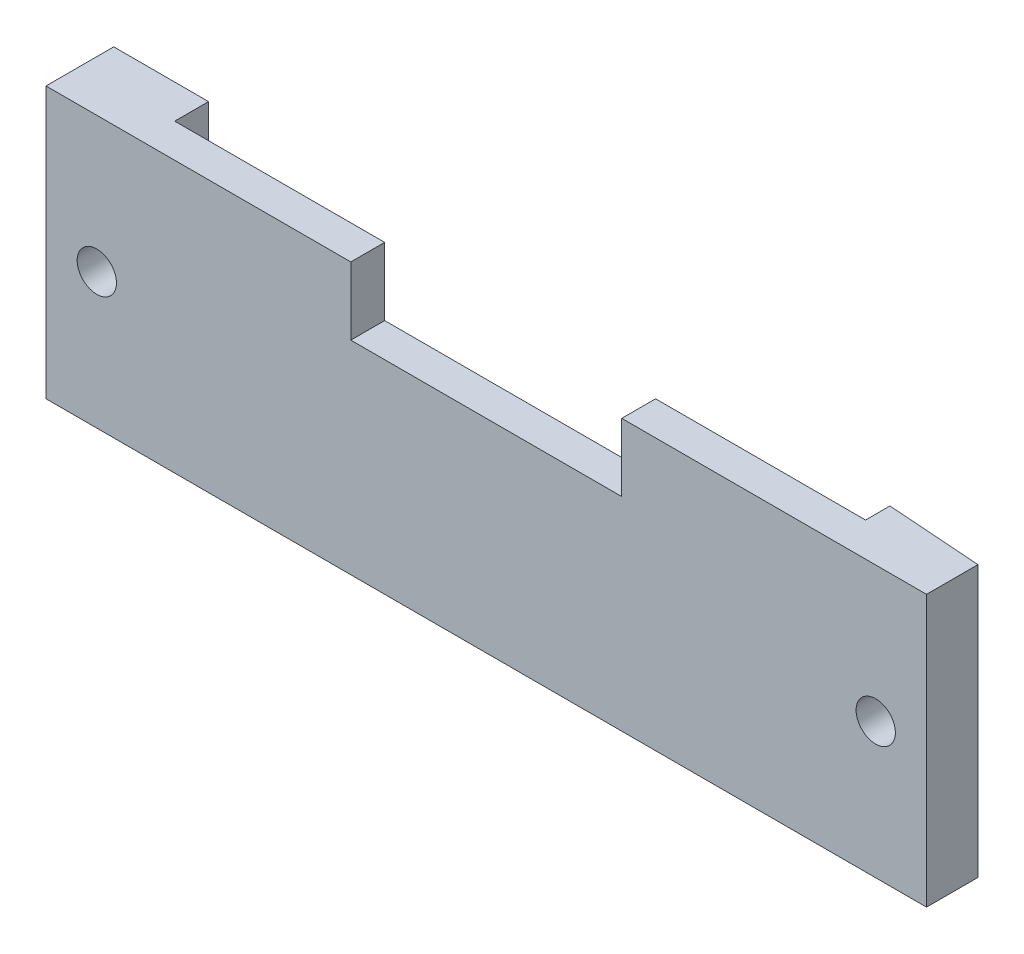
ISO-10303-21;
HEADER;
FILE_DESCRIPTION(('STEP AP214'),'2;1');
FILE_NAME('part.step','',(''),(''),'','','');
FILE_SCHEMA(('AUTOMOTIVE_DESIGN { 1 0 10303 214 1 1 1 1 }'));
ENDSEC;
DATA;
#1=APPLICATION_CONTEXT('core data for automotive mechanical design processes');
#2=APPLICATION_PROTOCOL_DEFINITION('international standard','automotive_design',2000,#1);
#3=PRODUCT_CONTEXT('',#1,'mechanical');
#4=PRODUCT('Part','Part','',(#3));
#5=PRODUCT_RELATED_PRODUCT_CATEGORY('part','',(#4));
#6=PRODUCT_DEFINITION_FORMATION('','',#4);
#7=PRODUCT_DEFINITION_CONTEXT('part definition',#1,'design');
#8=PRODUCT_DEFINITION('design','',#6,#7);
#9=PRODUCT_DEFINITION_SHAPE('','',#8);
#10=(LENGTH_UNIT() NAMED_UNIT(*) SI_UNIT(.MILLI.,.METRE.));
#11=(NAMED_UNIT(*) PLANE_ANGLE_UNIT() SI_UNIT($,.RADIAN.));
#12=(NAMED_UNIT(*) SI_UNIT($,.STERADIAN.) SOLID_ANGLE_UNIT());
#13=UNCERTAINTY_MEASURE_WITH_UNIT(LENGTH_MEASURE(1.E-05),#10,'distance_accuracy_value','');
#14=(GEOMETRIC_REPRESENTATION_CONTEXT(3) GLOBAL_UNCERTAINTY_ASSIGNED_CONTEXT((#13)) GLOBAL_UNIT_ASSIGNED_CONTEXT((#10,
#11,#12)) REPRESENTATION_CONTEXT('',''));
#15=CARTESIAN_POINT('',(0.,0.,0.));
#16=DIRECTION('',(0.,0.,1.));
#17=DIRECTION('',(1.,0.,0.));
#18=AXIS2_PLACEMENT_3D('',#15,#16,#17);
#19=CARTESIAN_POINT('',(32.5,20.,5.));
#20=DIRECTION('',(0.,-1.,0.));
#21=DIRECTION('',(1.,0.,0.));
#22=AXIS2_PLACEMENT_3D('',#19,#20,#21);
#23=PLANE('',#22);
#24=DIRECTION('',(0.,0.,-1.));
#25=VECTOR('',#24,1.);
#26=CARTESIAN_POINT('',(32.5,20.,5.));
#27=LINE('',#26,#25);
#28=CARTESIAN_POINT('',(32.5,20.,5.));
#29=VERTEX_POINT('',#28);
#30=CARTESIAN_POINT('',(32.5,20.,1.2));
#31=VERTEX_POINT('',#30);
#32=EDGE_CURVE('E48',#29,#31,#27,.T.);
#33=ORIENTED_EDGE('',*,*,#32,.T.);
#34=DIRECTION('',(0.997458699830735,0.,0.0712470499879097));
#35=VECTOR('',#34,1.);
#36=CARTESIAN_POINT('',(25.5,20.,0.699999999999999));
#37=LINE('',#36,#35);
#38=CARTESIAN_POINT('',(25.5,20.,0.699999999999999));
#39=VERTEX_POINT('',#38);
#40=EDGE_CURVE('E131',#39,#31,#37,.T.);
#41=ORIENTED_EDGE('',*,*,#40,.F.);
#42=DIRECTION('',(0.,0.,-1.));
#43=VECTOR('',#42,1.);
#44=CARTESIAN_POINT('',(25.5,20.,2.5));
#45=LINE('',#44,#43);
#46=CARTESIAN_POINT('',(25.5,20.,2.5));
#47=VERTEX_POINT('',#46);
#48=EDGE_CURVE('E166',#47,#39,#45,.T.);
#49=ORIENTED_EDGE('',*,*,#48,.F.);
#50=DIRECTION('',(1.,0.,0.));
#51=VECTOR('',#50,1.);
#52=CARTESIAN_POINT('',(-25.5,20.,2.5));
#53=LINE('',#52,#51);
#54=CARTESIAN_POINT('',(10.,20.,2.5));
#55=VERTEX_POINT('',#54);
#56=EDGE_CURVE('E209',#55,#47,#53,.T.);
#57=ORIENTED_EDGE('',*,*,#56,.F.);
#58=DIRECTION('',(0.,0.,1.));
#59=VECTOR('',#58,1.);
#60=CARTESIAN_POINT('',(10.,20.,-0.001000000000001));
#61=LINE('',#60,#59);
#62=CARTESIAN_POINT('',(10.,20.,5.));
#63=VERTEX_POINT('',#62);
#64=EDGE_CURVE('E179',#55,#63,#61,.T.);
#65=ORIENTED_EDGE('',*,*,#64,.T.);
#66=DIRECTION('',(-1.,0.,0.));
#67=VECTOR('',#66,1.);
#68=CARTESIAN_POINT('',(32.5,20.,5.));
#69=LINE('',#68,#67);
#70=EDGE_CURVE('E153',#29,#63,#69,.T.);
#71=ORIENTED_EDGE('',*,*,#70,.F.);
#72=EDGE_LOOP('',(#33,#41,#49,#57,#65,#71));
#73=FACE_BOUND('',#72,.T.);
#74=ADVANCED_FACE('F40',(#73),#23,.F.);
#75=CARTESIAN_POINT('',(0.,0.,0.));
#76=DIRECTION('',(0.,0.,-1.));
#77=DIRECTION('',(-1.,0.,0.));
#78=AXIS2_PLACEMENT_3D('',#75,#76,#77);
#79=PLANE('',#78);
#80=CARTESIAN_POINT('',(-28.75,9.99999999999999,0.));
#81=DIRECTION('',(0.,0.,-1.));
#82=DIRECTION('',(-1.,0.,0.));
#83=AXIS2_PLACEMENT_3D('',#80,#81,#82);
#84=CIRCLE('',#83,1.44999999999999);
#85=CARTESIAN_POINT('',(-30.2,9.99999999999999,0.));
#86=VERTEX_POINT('',#85);
#87=EDGE_CURVE('E203',#86,#86,#84,.T.);
#88=ORIENTED_EDGE('',*,*,#87,.F.);
#89=EDGE_LOOP('',(#88));
#90=FACE_BOUND('',#89,.T.);
#91=DIRECTION('',(0.,-1.,0.));
#92=VECTOR('',#91,1.);
#93=CARTESIAN_POINT('',(-25.5,20.001,0.));
#94=LINE('',#93,#92);
#95=CARTESIAN_POINT('',(-25.5,20.,0.));
#96=VERTEX_POINT('',#95);
#97=CARTESIAN_POINT('',(-25.5,0.,0.));
#98=VERTEX_POINT('',#97);
#99=EDGE_CURVE('E223',#96,#98,#94,.T.);
#100=ORIENTED_EDGE('',*,*,#99,.T.);
#101=DIRECTION('',(1.,0.,0.));
#102=VECTOR('',#101,1.);
#103=CARTESIAN_POINT('',(0.,0.,0.));
#104=LINE('',#103,#102);
#105=CARTESIAN_POINT('',(-32.5,0.,0.));
#106=VERTEX_POINT('',#105);
#107=EDGE_CURVE('E162',#106,#98,#104,.T.);
#108=ORIENTED_EDGE('',*,*,#107,.F.);
#109=DIRECTION('',(0.,-1.,0.));
#110=VECTOR('',#109,1.);
#111=CARTESIAN_POINT('',(-32.5,0.,0.));
#112=LINE('',#111,#110);
#113=CARTESIAN_POINT('',(-32.5,20.,0.));
#114=VERTEX_POINT('',#113);
#115=EDGE_CURVE('E155',#114,#106,#112,.T.);
#116=ORIENTED_EDGE('',*,*,#115,.F.);
#117=DIRECTION('',(-1.,0.,0.));
#118=VECTOR('',#117,1.);
#119=CARTESIAN_POINT('',(32.5,20.,0.));
#120=LINE('',#119,#118);
#121=EDGE_CURVE('E165',#96,#114,#120,.T.);
#122=ORIENTED_EDGE('',*,*,#121,.F.);
#123=EDGE_LOOP('',(#100,#108,#116,#122));
#124=FACE_BOUND('',#123,.T.);
#125=ADVANCED_FACE('F275',(#90,#124),#79,.T.);
#126=CARTESIAN_POINT('',(0.,0.,5.));
#127=DIRECTION('',(0.,1.,0.));
#128=DIRECTION('',(0.,0.,1.));
#129=AXIS2_PLACEMENT_3D('',#126,#127,#128);
#130=PLANE('',#129);
#131=DIRECTION('',(0.,0.,1.));
#132=VECTOR('',#131,1.);
#133=CARTESIAN_POINT('',(25.5,0.,2.5));
#134=LINE('',#133,#132);
#135=CARTESIAN_POINT('',(25.5,0.,0.699999999999999));
#136=VERTEX_POINT('',#135);
#137=CARTESIAN_POINT('',(25.5,0.,2.5));
#138=VERTEX_POINT('',#137);
#139=EDGE_CURVE('E143',#136,#138,#134,.T.);
#140=ORIENTED_EDGE('',*,*,#139,.F.);
#141=DIRECTION('',(-0.997458699830735,0.,-0.0712470499879097));
#142=VECTOR('',#141,1.);
#143=CARTESIAN_POINT('',(25.5,0.,0.699999999999999));
#144=LINE('',#143,#142);
#145=CARTESIAN_POINT('',(32.5,0.,1.2));
#146=VERTEX_POINT('',#145);
#147=EDGE_CURVE('E55',#146,#136,#144,.T.);
#148=ORIENTED_EDGE('',*,*,#147,.F.);
#149=DIRECTION('',(0.,0.,-1.));
#150=VECTOR('',#149,1.);
#151=CARTESIAN_POINT('',(32.5,0.,5.));
#152=LINE('',#151,#150);
#153=CARTESIAN_POINT('',(32.5,0.,5.));
#154=VERTEX_POINT('',#153);
#155=EDGE_CURVE('E11',#154,#146,#152,.T.);
#156=ORIENTED_EDGE('',*,*,#155,.F.);
#157=DIRECTION('',(1.,0.,0.));
#158=VECTOR('',#157,1.);
#159=CARTESIAN_POINT('',(0.,0.,5.));
#160=LINE('',#159,#158);
#161=CARTESIAN_POINT('',(-32.5,0.,5.));
#162=VERTEX_POINT('',#161);
#163=EDGE_CURVE('E151',#162,#154,#160,.T.);
#164=ORIENTED_EDGE('',*,*,#163,.F.);
#165=DIRECTION('',(0.,0.,-1.));
#166=VECTOR('',#165,1.);
#167=CARTESIAN_POINT('',(-32.5,0.,5.));
#168=LINE('',#167,#166);
#169=EDGE_CURVE('E161',#162,#106,#168,.T.);
#170=ORIENTED_EDGE('',*,*,#169,.T.);
#171=ORIENTED_EDGE('',*,*,#107,.T.);
#172=DIRECTION('',(0.,0.,-1.));
#173=VECTOR('',#172,1.);
#174=CARTESIAN_POINT('',(-25.5,0.,0.));
#175=LINE('',#174,#173);
#176=CARTESIAN_POINT('',(-25.5,0.,2.5));
#177=VERTEX_POINT('',#176);
#178=EDGE_CURVE('E220',#177,#98,#175,.T.);
#179=ORIENTED_EDGE('',*,*,#178,.F.);
#180=DIRECTION('',(-1.,0.,0.));
#181=VECTOR('',#180,1.);
#182=CARTESIAN_POINT('',(-25.5,0.,2.5));
#183=LINE('',#182,#181);
#184=EDGE_CURVE('E217',#138,#177,#183,.T.);
#185=ORIENTED_EDGE('',*,*,#184,.F.);
#186=EDGE_LOOP('',(#140,#148,#156,#164,#170,#171,#179,#185));
#187=FACE_BOUND('',#186,.T.);
#188=ADVANCED_FACE('F42',(#187),#130,.F.);
#189=CARTESIAN_POINT('',(32.5,0.,5.));
#190=DIRECTION('',(-1.,0.,0.));
#191=DIRECTION('',(0.,0.,1.));
#192=AXIS2_PLACEMENT_3D('',#189,#190,#191);
#193=PLANE('',#192);
#194=ORIENTED_EDGE('',*,*,#155,.T.);
#195=DIRECTION('',(0.,-1.,0.));
#196=VECTOR('',#195,1.);
#197=CARTESIAN_POINT('',(32.5,20.001,1.2));
#198=LINE('',#197,#196);
#199=EDGE_CURVE('E127',#31,#146,#198,.T.);
#200=ORIENTED_EDGE('',*,*,#199,.F.);
#201=ORIENTED_EDGE('',*,*,#32,.F.);
#202=DIRECTION('',(0.,1.,0.));
#203=VECTOR('',#202,1.);
#204=CARTESIAN_POINT('',(32.5,0.,5.));
#205=LINE('',#204,#203);
#206=EDGE_CURVE('E146',#154,#29,#205,.T.);
#207=ORIENTED_EDGE('',*,*,#206,.F.);
#208=EDGE_LOOP('',(#194,#200,#201,#207));
#209=FACE_BOUND('',#208,.T.);
#210=ADVANCED_FACE('F145',(#209),#193,.F.);
#211=CARTESIAN_POINT('',(-10.,20.,5.));
#212=VERTEX_POINT('',#211);
#213=CARTESIAN_POINT('',(-32.5,20.,5.));
#214=VERTEX_POINT('',#213);
#215=EDGE_CURVE('E150',#212,#214,#69,.T.);
#216=ORIENTED_EDGE('',*,*,#215,.F.);
#217=DIRECTION('',(0.,0.,1.));
#218=VECTOR('',#217,1.);
#219=CARTESIAN_POINT('',(-10.,20.,-0.001000000000001));
#220=LINE('',#219,#218);
#221=CARTESIAN_POINT('',(-10.,20.,2.5));
#222=VERTEX_POINT('',#221);
#223=EDGE_CURVE('E188',#222,#212,#220,.T.);
#224=ORIENTED_EDGE('',*,*,#223,.F.);
#225=CARTESIAN_POINT('',(-25.5,20.,2.5));
#226=VERTEX_POINT('',#225);
#227=EDGE_CURVE('E210',#226,#222,#53,.T.);
#228=ORIENTED_EDGE('',*,*,#227,.F.);
#229=DIRECTION('',(0.,0.,1.));
#230=VECTOR('',#229,1.);
#231=CARTESIAN_POINT('',(-25.5,20.,0.));
#232=LINE('',#231,#230);
#233=EDGE_CURVE('E213',#96,#226,#232,.T.);
#234=ORIENTED_EDGE('',*,*,#233,.F.);
#235=ORIENTED_EDGE('',*,*,#121,.T.);
#236=DIRECTION('',(0.,0.,-1.));
#237=VECTOR('',#236,1.);
#238=CARTESIAN_POINT('',(-32.5,20.,5.));
#239=LINE('',#238,#237);
#240=EDGE_CURVE('E172',#214,#114,#239,.T.);
#241=ORIENTED_EDGE('',*,*,#240,.F.);
#242=EDGE_LOOP('',(#216,#224,#228,#234,#235,#241));
#243=FACE_BOUND('',#242,.T.);
#244=ADVANCED_FACE('F268',(#243),#23,.F.);
#245=CARTESIAN_POINT('',(-32.5,0.,5.));
#246=DIRECTION('',(1.,0.,0.));
#247=DIRECTION('',(0.,0.,-1.));
#248=AXIS2_PLACEMENT_3D('',#245,#246,#247);
#249=PLANE('',#248);
#250=ORIENTED_EDGE('',*,*,#115,.T.);
#251=ORIENTED_EDGE('',*,*,#169,.F.);
#252=DIRECTION('',(0.,-1.,0.));
#253=VECTOR('',#252,1.);
#254=CARTESIAN_POINT('',(-32.5,0.,5.));
#255=LINE('',#254,#253);
#256=EDGE_CURVE('E159',#214,#162,#255,.T.);
#257=ORIENTED_EDGE('',*,*,#256,.F.);
#258=ORIENTED_EDGE('',*,*,#240,.T.);
#259=EDGE_LOOP('',(#250,#251,#257,#258));
#260=FACE_BOUND('',#259,.T.);
#261=ADVANCED_FACE('F259',(#260),#249,.F.);
#262=CARTESIAN_POINT('',(0.,0.,5.));
#263=DIRECTION('',(0.,0.,-1.));
#264=DIRECTION('',(-1.,0.,0.));
#265=AXIS2_PLACEMENT_3D('',#262,#263,#264);
#266=PLANE('',#265);
#267=CARTESIAN_POINT('',(-28.75,9.99999999999999,5.));
#268=DIRECTION('',(0.,0.,1.));
#269=DIRECTION('',(1.,0.,0.));
#270=AXIS2_PLACEMENT_3D('',#267,#268,#269);
#271=CIRCLE('',#270,1.44999999999999);
#272=CARTESIAN_POINT('',(-27.3,9.99999999999999,5.));
#273=VERTEX_POINT('',#272);
#274=EDGE_CURVE('E197',#273,#273,#271,.T.);
#275=ORIENTED_EDGE('',*,*,#274,.F.);
#276=EDGE_LOOP('',(#275));
#277=FACE_BOUND('',#276,.T.);
#278=CARTESIAN_POINT('',(28.75,10.,5.));
#279=DIRECTION('',(0.,0.,1.));
#280=DIRECTION('',(1.,0.,0.));
#281=AXIS2_PLACEMENT_3D('',#278,#279,#280);
#282=CIRCLE('',#281,1.44999999999999);
#283=CARTESIAN_POINT('',(30.2,10.,5.));
#284=VERTEX_POINT('',#283);
#285=EDGE_CURVE('E206',#284,#284,#282,.T.);
#286=ORIENTED_EDGE('',*,*,#285,.F.);
#287=EDGE_LOOP('',(#286));
#288=FACE_BOUND('',#287,.T.);
#289=ORIENTED_EDGE('',*,*,#70,.T.);
#290=DIRECTION('',(0.,1.,0.));
#291=VECTOR('',#290,1.);
#292=CARTESIAN_POINT('',(10.,15.,5.));
#293=LINE('',#292,#291);
#294=CARTESIAN_POINT('',(10.,15.,5.));
#295=VERTEX_POINT('',#294);
#296=EDGE_CURVE('E183',#295,#63,#293,.T.);
#297=ORIENTED_EDGE('',*,*,#296,.F.);
#298=DIRECTION('',(1.,0.,0.));
#299=VECTOR('',#298,1.);
#300=CARTESIAN_POINT('',(-10.,15.,5.));
#301=LINE('',#300,#299);
#302=CARTESIAN_POINT('',(-10.,15.,5.));
#303=VERTEX_POINT('',#302);
#304=EDGE_CURVE('E186',#303,#295,#301,.T.);
#305=ORIENTED_EDGE('',*,*,#304,.F.);
#306=DIRECTION('',(0.,-1.,0.));
#307=VECTOR('',#306,1.);
#308=CARTESIAN_POINT('',(-10.,20.,5.));
#309=LINE('',#308,#307);
#310=EDGE_CURVE('E192',#212,#303,#309,.T.);
#311=ORIENTED_EDGE('',*,*,#310,.F.);
#312=ORIENTED_EDGE('',*,*,#215,.T.);
#313=ORIENTED_EDGE('',*,*,#256,.T.);
#314=ORIENTED_EDGE('',*,*,#163,.T.);
#315=ORIENTED_EDGE('',*,*,#206,.T.);
#316=EDGE_LOOP('',(#289,#297,#305,#311,#312,#313,#314,#315));
#317=FACE_BOUND('',#316,.T.);
#318=ADVANCED_FACE('F181',(#277,#288,#317),#266,.F.);
#319=CARTESIAN_POINT('',(-25.5,20.001,0.));
#320=DIRECTION('',(-1.,0.,0.));
#321=DIRECTION('',(0.,0.,1.));
#322=AXIS2_PLACEMENT_3D('',#319,#320,#321);
#323=PLANE('',#322);
#324=ORIENTED_EDGE('',*,*,#233,.T.);
#325=DIRECTION('',(0.,-1.,0.));
#326=VECTOR('',#325,1.);
#327=CARTESIAN_POINT('',(-25.5,20.001,2.5));
#328=LINE('',#327,#326);
#329=EDGE_CURVE('E226',#226,#177,#328,.T.);
#330=ORIENTED_EDGE('',*,*,#329,.T.);
#331=ORIENTED_EDGE('',*,*,#178,.T.);
#332=ORIENTED_EDGE('',*,*,#99,.F.);
#333=EDGE_LOOP('',(#324,#330,#331,#332));
#334=FACE_BOUND('',#333,.T.);
#335=ADVANCED_FACE('F258',(#334),#323,.F.);
#336=CARTESIAN_POINT('',(-25.5,20.001,2.5));
#337=DIRECTION('',(0.,0.,1.));
#338=DIRECTION('',(1.,0.,0.));
#339=AXIS2_PLACEMENT_3D('',#336,#337,#338);
#340=PLANE('',#339);
#341=DIRECTION('',(-1.,0.,0.));
#342=VECTOR('',#341,1.);
#343=CARTESIAN_POINT('',(-10.,15.,2.5));
#344=LINE('',#343,#342);
#345=CARTESIAN_POINT('',(10.,15.,2.5));
#346=VERTEX_POINT('',#345);
#347=CARTESIAN_POINT('',(-10.,15.,2.5));
#348=VERTEX_POINT('',#347);
#349=EDGE_CURVE('E63',#346,#348,#344,.T.);
#350=ORIENTED_EDGE('',*,*,#349,.F.);
#351=DIRECTION('',(0.,-1.,0.));
#352=VECTOR('',#351,1.);
#353=CARTESIAN_POINT('',(10.,15.,2.5));
#354=LINE('',#353,#352);
#355=EDGE_CURVE('E236',#55,#346,#354,.T.);
#356=ORIENTED_EDGE('',*,*,#355,.F.);
#357=ORIENTED_EDGE('',*,*,#56,.T.);
#358=DIRECTION('',(0.,-1.,0.));
#359=VECTOR('',#358,1.);
#360=CARTESIAN_POINT('',(25.5,20.001,2.5));
#361=LINE('',#360,#359);
#362=EDGE_CURVE('E222',#47,#138,#361,.T.);
#363=ORIENTED_EDGE('',*,*,#362,.T.);
#364=ORIENTED_EDGE('',*,*,#184,.T.);
#365=ORIENTED_EDGE('',*,*,#329,.F.);
#366=ORIENTED_EDGE('',*,*,#227,.T.);
#367=DIRECTION('',(0.,1.,0.));
#368=VECTOR('',#367,1.);
#369=CARTESIAN_POINT('',(-10.,20.,2.5));
#370=LINE('',#369,#368);
#371=EDGE_CURVE('E240',#348,#222,#370,.T.);
#372=ORIENTED_EDGE('',*,*,#371,.F.);
#373=EDGE_LOOP('',(#350,#356,#357,#363,#364,#365,#366,#372));
#374=FACE_BOUND('',#373,.T.);
#375=ADVANCED_FACE('F234',(#374),#340,.F.);
#376=CARTESIAN_POINT('',(25.5,20.001,2.5));
#377=DIRECTION('',(1.,0.,0.));
#378=DIRECTION('',(0.,0.,-1.));
#379=AXIS2_PLACEMENT_3D('',#376,#377,#378);
#380=PLANE('',#379);
#381=ORIENTED_EDGE('',*,*,#48,.T.);
#382=DIRECTION('',(0.,-1.,0.));
#383=VECTOR('',#382,1.);
#384=CARTESIAN_POINT('',(25.5,20.001,0.699999999999999));
#385=LINE('',#384,#383);
#386=EDGE_CURVE('E135',#39,#136,#385,.T.);
#387=ORIENTED_EDGE('',*,*,#386,.T.);
#388=ORIENTED_EDGE('',*,*,#139,.T.);
#389=ORIENTED_EDGE('',*,*,#362,.F.);
#390=EDGE_LOOP('',(#381,#387,#388,#389));
#391=FACE_BOUND('',#390,.T.);
#392=ADVANCED_FACE('F231',(#391),#380,.F.);
#393=CARTESIAN_POINT('',(28.75,10.,5.));
#394=DIRECTION('',(0.,0.,1.));
#395=DIRECTION('',(1.,0.,0.));
#396=AXIS2_PLACEMENT_3D('',#393,#394,#395);
#397=CYLINDRICAL_SURFACE('',#396,1.44999999999999);
#398=CARTESIAN_POINT('',(28.75,10.,0.932142857142856));
#399=DIRECTION('',(-0.0712470499879097,0.,0.997458699830735));
#400=DIRECTION('',(0.997458699830735,0.,0.0712470499879097));
#401=AXIS2_PLACEMENT_3D('',#398,#399,#400);
#402=ELLIPSE('',#401,1.45369427350331,1.44999999999999);
#403=CARTESIAN_POINT('',(30.2,10.,1.03571428571428));
#404=VERTEX_POINT('',#403);
#405=EDGE_CURVE('E244',#404,#404,#402,.T.);
#406=ORIENTED_EDGE('',*,*,#405,.F.);
#407=EDGE_LOOP('',(#406));
#408=FACE_BOUND('',#407,.T.);
#409=ORIENTED_EDGE('',*,*,#285,.T.);
#410=EDGE_LOOP('',(#409));
#411=FACE_BOUND('',#410,.T.);
#412=ADVANCED_FACE('F250',(#408,#411),#397,.F.);
#413=CARTESIAN_POINT('',(-28.75,9.99999999999999,5.));
#414=DIRECTION('',(0.,0.,1.));
#415=DIRECTION('',(1.,0.,0.));
#416=AXIS2_PLACEMENT_3D('',#413,#414,#415);
#417=CYLINDRICAL_SURFACE('',#416,1.44999999999999);
#418=ORIENTED_EDGE('',*,*,#274,.T.);
#419=EDGE_LOOP('',(#418));
#420=FACE_BOUND('',#419,.T.);
#421=ORIENTED_EDGE('',*,*,#87,.T.);
#422=EDGE_LOOP('',(#421));
#423=FACE_BOUND('',#422,.T.);
#424=ADVANCED_FACE('F253',(#420,#423),#417,.F.);
#425=CARTESIAN_POINT('',(10.,15.,-0.001000000000001));
#426=DIRECTION('',(1.,0.,0.));
#427=DIRECTION('',(0.,0.,-1.));
#428=AXIS2_PLACEMENT_3D('',#425,#426,#427);
#429=PLANE('',#428);
#430=ORIENTED_EDGE('',*,*,#355,.T.);
#431=DIRECTION('',(0.,0.,1.));
#432=VECTOR('',#431,1.);
#433=CARTESIAN_POINT('',(10.,15.,-0.001000000000001));
#434=LINE('',#433,#432);
#435=EDGE_CURVE('E198',#346,#295,#434,.T.);
#436=ORIENTED_EDGE('',*,*,#435,.T.);
#437=ORIENTED_EDGE('',*,*,#296,.T.);
#438=ORIENTED_EDGE('',*,*,#64,.F.);
#439=EDGE_LOOP('',(#430,#436,#437,#438));
#440=FACE_BOUND('',#439,.T.);
#441=ADVANCED_FACE('F300',(#440),#429,.F.);
#442=CARTESIAN_POINT('',(-10.,15.,-0.001000000000001));
#443=DIRECTION('',(0.,-1.,0.));
#444=DIRECTION('',(0.,0.,-1.));
#445=AXIS2_PLACEMENT_3D('',#442,#443,#444);
#446=PLANE('',#445);
#447=ORIENTED_EDGE('',*,*,#349,.T.);
#448=DIRECTION('',(0.,0.,1.));
#449=VECTOR('',#448,1.);
#450=CARTESIAN_POINT('',(-10.,15.,-0.001000000000001));
#451=LINE('',#450,#449);
#452=EDGE_CURVE('E190',#348,#303,#451,.T.);
#453=ORIENTED_EDGE('',*,*,#452,.T.);
#454=ORIENTED_EDGE('',*,*,#304,.T.);
#455=ORIENTED_EDGE('',*,*,#435,.F.);
#456=EDGE_LOOP('',(#447,#453,#454,#455));
#457=FACE_BOUND('',#456,.T.);
#458=ADVANCED_FACE('F299',(#457),#446,.F.);
#459=CARTESIAN_POINT('',(-10.,20.,-0.001000000000001));
#460=DIRECTION('',(-1.,0.,0.));
#461=DIRECTION('',(0.,0.,1.));
#462=AXIS2_PLACEMENT_3D('',#459,#460,#461);
#463=PLANE('',#462);
#464=ORIENTED_EDGE('',*,*,#371,.T.);
#465=ORIENTED_EDGE('',*,*,#223,.T.);
#466=ORIENTED_EDGE('',*,*,#310,.T.);
#467=ORIENTED_EDGE('',*,*,#452,.F.);
#468=EDGE_LOOP('',(#464,#465,#466,#467));
#469=FACE_BOUND('',#468,.T.);
#470=ADVANCED_FACE('F293',(#469),#463,.F.);
#471=CARTESIAN_POINT('',(25.5,20.001,0.699999999999999));
#472=DIRECTION('',(-0.0712470499879097,0.,0.997458699830735));
#473=DIRECTION('',(0.997458699830735,0.,0.0712470499879097));
#474=AXIS2_PLACEMENT_3D('',#471,#472,#473);
#475=PLANE('',#474);
#476=ORIENTED_EDGE('',*,*,#40,.T.);
#477=ORIENTED_EDGE('',*,*,#199,.T.);
#478=ORIENTED_EDGE('',*,*,#147,.T.);
#479=ORIENTED_EDGE('',*,*,#386,.F.);
#480=EDGE_LOOP('',(#476,#477,#478,#479));
#481=FACE_BOUND('',#480,.T.);
#482=ORIENTED_EDGE('',*,*,#405,.T.);
#483=EDGE_LOOP('',(#482));
#484=FACE_BOUND('',#483,.T.);
#485=ADVANCED_FACE('F128',(#481,#484),#475,.F.);
#486=CLOSED_SHELL('',(#74,#125,#188,#210,#244,#261,#318,#335,#375,#392,#412,#424,#441,#458,#470,#485));
#487=MANIFOLD_SOLID_BREP('B2',#486);
#488=ADVANCED_BREP_SHAPE_REPRESENTATION('',(#18,#487),#14);
#489=SHAPE_DEFINITION_REPRESENTATION(#9,#488);
ENDSEC;
END-ISO-10303-21;
